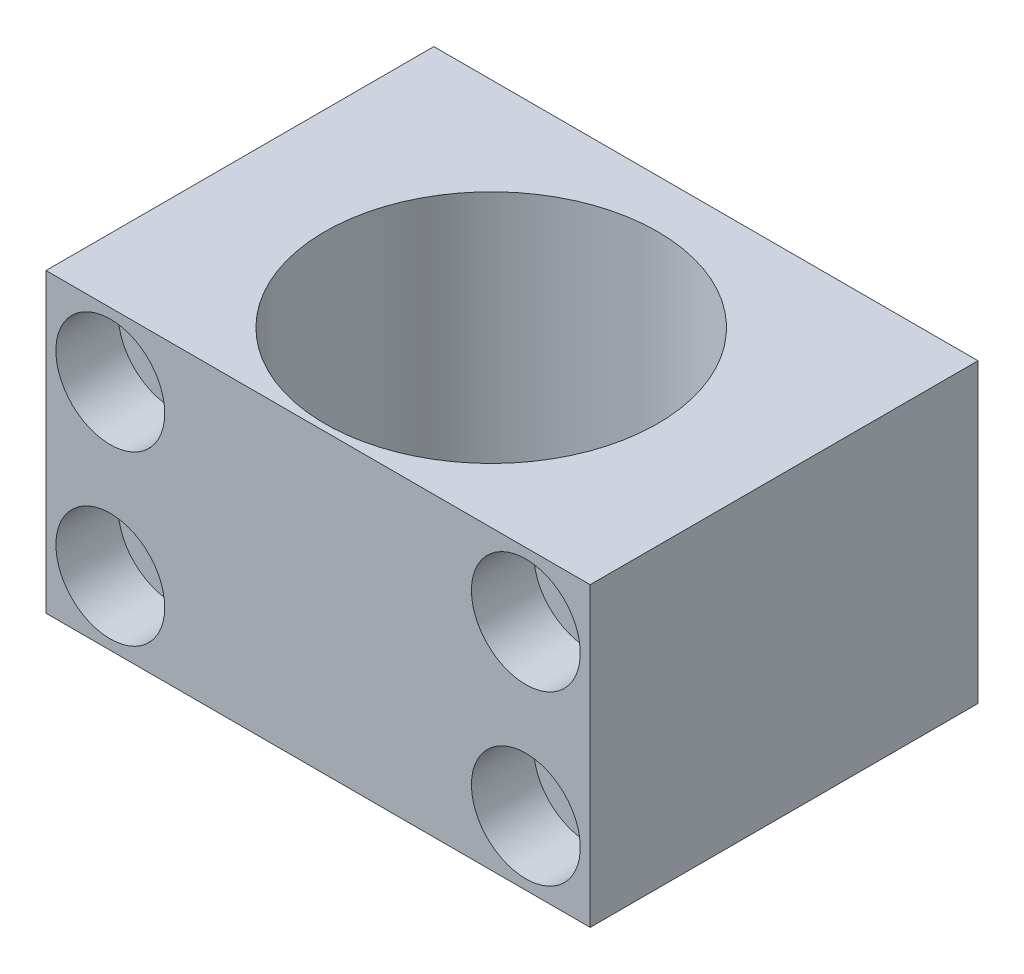
ISO-10303-21;
HEADER;
FILE_DESCRIPTION(('STEP AP214'),'2;1');
FILE_NAME('part.step','',(''),(''),'','','');
FILE_SCHEMA(('AUTOMOTIVE_DESIGN { 1 0 10303 214 1 1 1 1 }'));
ENDSEC;
DATA;
#1=APPLICATION_CONTEXT('core data for automotive mechanical design processes');
#2=APPLICATION_PROTOCOL_DEFINITION('international standard','automotive_design',2000,#1);
#3=PRODUCT_CONTEXT('',#1,'mechanical');
#4=PRODUCT('Part','Part','',(#3));
#5=PRODUCT_RELATED_PRODUCT_CATEGORY('part','',(#4));
#6=PRODUCT_DEFINITION_FORMATION('','',#4);
#7=PRODUCT_DEFINITION_CONTEXT('part definition',#1,'design');
#8=PRODUCT_DEFINITION('design','',#6,#7);
#9=PRODUCT_DEFINITION_SHAPE('','',#8);
#10=(LENGTH_UNIT() NAMED_UNIT(*) SI_UNIT(.MILLI.,.METRE.));
#11=(NAMED_UNIT(*) PLANE_ANGLE_UNIT() SI_UNIT($,.RADIAN.));
#12=(NAMED_UNIT(*) SI_UNIT($,.STERADIAN.) SOLID_ANGLE_UNIT());
#13=UNCERTAINTY_MEASURE_WITH_UNIT(LENGTH_MEASURE(1.E-05),#10,'distance_accuracy_value','');
#14=(GEOMETRIC_REPRESENTATION_CONTEXT(3) GLOBAL_UNCERTAINTY_ASSIGNED_CONTEXT((#13)) GLOBAL_UNIT_ASSIGNED_CONTEXT((#10,
#11,#12)) REPRESENTATION_CONTEXT('',''));
#15=CARTESIAN_POINT('',(0.,0.,0.));
#16=DIRECTION('',(0.,0.,1.));
#17=DIRECTION('',(1.,0.,0.));
#18=AXIS2_PLACEMENT_3D('',#15,#16,#17);
#19=CARTESIAN_POINT('',(-27.5,30.,-19.6));
#20=DIRECTION('',(1.,0.,0.));
#21=DIRECTION('',(0.,0.,-1.));
#22=AXIS2_PLACEMENT_3D('',#19,#20,#21);
#23=PLANE('',#22);
#24=DIRECTION('',(0.,0.,1.));
#25=VECTOR('',#24,1.);
#26=CARTESIAN_POINT('',(-27.5,0.,-19.6));
#27=LINE('',#26,#25);
#28=CARTESIAN_POINT('',(-27.5,0.,-19.6));
#29=VERTEX_POINT('',#28);
#30=CARTESIAN_POINT('',(-27.5,0.,19.6));
#31=VERTEX_POINT('',#30);
#32=EDGE_CURVE('E113',#29,#31,#27,.T.);
#33=ORIENTED_EDGE('',*,*,#32,.T.);
#34=DIRECTION('',(0.,-1.,0.));
#35=VECTOR('',#34,1.);
#36=CARTESIAN_POINT('',(-27.5,30.,19.6));
#37=LINE('',#36,#35);
#38=CARTESIAN_POINT('',(-27.5,30.,19.6));
#39=VERTEX_POINT('',#38);
#40=EDGE_CURVE('E11',#39,#31,#37,.T.);
#41=ORIENTED_EDGE('',*,*,#40,.F.);
#42=DIRECTION('',(0.,0.,1.));
#43=VECTOR('',#42,1.);
#44=CARTESIAN_POINT('',(-27.5,30.,-19.6));
#45=LINE('',#44,#43);
#46=CARTESIAN_POINT('',(-27.5,30.,-19.6));
#47=VERTEX_POINT('',#46);
#48=EDGE_CURVE('E98',#47,#39,#45,.T.);
#49=ORIENTED_EDGE('',*,*,#48,.F.);
#50=DIRECTION('',(0.,-1.,0.));
#51=VECTOR('',#50,1.);
#52=CARTESIAN_POINT('',(-27.5,30.,-19.6));
#53=LINE('',#52,#51);
#54=EDGE_CURVE('E112',#47,#29,#53,.T.);
#55=ORIENTED_EDGE('',*,*,#54,.T.);
#56=EDGE_LOOP('',(#33,#41,#49,#55));
#57=FACE_BOUND('',#56,.T.);
#58=ADVANCED_FACE('F42',(#57),#23,.F.);
#59=CARTESIAN_POINT('',(27.5,30.,19.6));
#60=DIRECTION('',(0.,0.,-1.));
#61=DIRECTION('',(-1.,0.,0.));
#62=AXIS2_PLACEMENT_3D('',#59,#60,#61);
#63=PLANE('',#62);
#64=CARTESIAN_POINT('',(21.,23.5,19.6));
#65=DIRECTION('',(0.,0.,1.));
#66=DIRECTION('',(-1.,0.,0.));
#67=AXIS2_PLACEMENT_3D('',#64,#65,#66);
#68=CIRCLE('',#67,5.5);
#69=CARTESIAN_POINT('',(15.5,23.5,19.6));
#70=VERTEX_POINT('',#69);
#71=EDGE_CURVE('E147',#70,#70,#68,.T.);
#72=ORIENTED_EDGE('',*,*,#71,.F.);
#73=EDGE_LOOP('',(#72));
#74=FACE_BOUND('',#73,.T.);
#75=CARTESIAN_POINT('',(21.,6.5,19.6));
#76=DIRECTION('',(0.,0.,1.));
#77=DIRECTION('',(-1.,0.,0.));
#78=AXIS2_PLACEMENT_3D('',#75,#76,#77);
#79=CIRCLE('',#78,5.5);
#80=CARTESIAN_POINT('',(15.5,6.5,19.6));
#81=VERTEX_POINT('',#80);
#82=EDGE_CURVE('E181',#81,#81,#79,.T.);
#83=ORIENTED_EDGE('',*,*,#82,.F.);
#84=EDGE_LOOP('',(#83));
#85=FACE_BOUND('',#84,.T.);
#86=CARTESIAN_POINT('',(-21.,6.5,19.6));
#87=DIRECTION('',(0.,0.,1.));
#88=DIRECTION('',(1.,0.,0.));
#89=AXIS2_PLACEMENT_3D('',#86,#87,#88);
#90=CIRCLE('',#89,5.5);
#91=CARTESIAN_POINT('',(-15.5,6.5,19.6));
#92=VERTEX_POINT('',#91);
#93=EDGE_CURVE('E166',#92,#92,#90,.T.);
#94=ORIENTED_EDGE('',*,*,#93,.F.);
#95=EDGE_LOOP('',(#94));
#96=FACE_BOUND('',#95,.T.);
#97=CARTESIAN_POINT('',(-21.,23.5,19.6));
#98=DIRECTION('',(0.,0.,1.));
#99=DIRECTION('',(1.,0.,0.));
#100=AXIS2_PLACEMENT_3D('',#97,#98,#99);
#101=CIRCLE('',#100,5.5);
#102=CARTESIAN_POINT('',(-15.5,23.5,19.6));
#103=VERTEX_POINT('',#102);
#104=EDGE_CURVE('E164',#103,#103,#101,.T.);
#105=ORIENTED_EDGE('',*,*,#104,.F.);
#106=EDGE_LOOP('',(#105));
#107=FACE_BOUND('',#106,.T.);
#108=DIRECTION('',(1.,0.,0.));
#109=VECTOR('',#108,1.);
#110=CARTESIAN_POINT('',(27.5,0.,19.6));
#111=LINE('',#110,#109);
#112=CARTESIAN_POINT('',(27.5,0.,19.6));
#113=VERTEX_POINT('',#112);
#114=EDGE_CURVE('E103',#31,#113,#111,.T.);
#115=ORIENTED_EDGE('',*,*,#114,.T.);
#116=DIRECTION('',(0.,-1.,0.));
#117=VECTOR('',#116,1.);
#118=CARTESIAN_POINT('',(27.5,30.,19.6));
#119=LINE('',#118,#117);
#120=CARTESIAN_POINT('',(27.5,30.,19.6));
#121=VERTEX_POINT('',#120);
#122=EDGE_CURVE('E53',#121,#113,#119,.T.);
#123=ORIENTED_EDGE('',*,*,#122,.F.);
#124=DIRECTION('',(1.,0.,0.));
#125=VECTOR('',#124,1.);
#126=CARTESIAN_POINT('',(27.5,30.,19.6));
#127=LINE('',#126,#125);
#128=EDGE_CURVE('E91',#39,#121,#127,.T.);
#129=ORIENTED_EDGE('',*,*,#128,.F.);
#130=ORIENTED_EDGE('',*,*,#40,.T.);
#131=EDGE_LOOP('',(#115,#123,#129,#130));
#132=FACE_BOUND('',#131,.T.);
#133=ADVANCED_FACE('F105',(#74,#85,#96,#107,#132),#63,.F.);
#134=CARTESIAN_POINT('',(27.5,30.,-19.6));
#135=DIRECTION('',(-1.,0.,0.));
#136=DIRECTION('',(0.,0.,1.));
#137=AXIS2_PLACEMENT_3D('',#134,#135,#136);
#138=PLANE('',#137);
#139=DIRECTION('',(0.,0.,-1.));
#140=VECTOR('',#139,1.);
#141=CARTESIAN_POINT('',(27.5,0.,-19.6));
#142=LINE('',#141,#140);
#143=CARTESIAN_POINT('',(27.5,0.,-19.6));
#144=VERTEX_POINT('',#143);
#145=EDGE_CURVE('E77',#113,#144,#142,.T.);
#146=ORIENTED_EDGE('',*,*,#145,.T.);
#147=DIRECTION('',(0.,-1.,0.));
#148=VECTOR('',#147,1.);
#149=CARTESIAN_POINT('',(27.5,30.,-19.6));
#150=LINE('',#149,#148);
#151=CARTESIAN_POINT('',(27.5,30.,-19.6));
#152=VERTEX_POINT('',#151);
#153=EDGE_CURVE('E104',#152,#144,#150,.T.);
#154=ORIENTED_EDGE('',*,*,#153,.F.);
#155=DIRECTION('',(0.,0.,-1.));
#156=VECTOR('',#155,1.);
#157=CARTESIAN_POINT('',(27.5,30.,-19.6));
#158=LINE('',#157,#156);
#159=EDGE_CURVE('E96',#121,#152,#158,.T.);
#160=ORIENTED_EDGE('',*,*,#159,.F.);
#161=ORIENTED_EDGE('',*,*,#122,.T.);
#162=EDGE_LOOP('',(#146,#154,#160,#161));
#163=FACE_BOUND('',#162,.T.);
#164=ADVANCED_FACE('F110',(#163),#138,.F.);
#165=CARTESIAN_POINT('',(27.5,30.,-19.6));
#166=DIRECTION('',(0.,0.,1.));
#167=DIRECTION('',(1.,0.,0.));
#168=AXIS2_PLACEMENT_3D('',#165,#166,#167);
#169=PLANE('',#168);
#170=CARTESIAN_POINT('',(21.,6.5,-19.6));
#171=DIRECTION('',(0.,0.,1.));
#172=DIRECTION('',(-1.,0.,0.));
#173=AXIS2_PLACEMENT_3D('',#170,#171,#172);
#174=CIRCLE('',#173,3.25);
#175=CARTESIAN_POINT('',(17.75,6.5,-19.6));
#176=VERTEX_POINT('',#175);
#177=EDGE_CURVE('E198',#176,#176,#174,.T.);
#178=ORIENTED_EDGE('',*,*,#177,.T.);
#179=EDGE_LOOP('',(#178));
#180=FACE_BOUND('',#179,.T.);
#181=CARTESIAN_POINT('',(21.,23.5,-19.6));
#182=DIRECTION('',(0.,0.,1.));
#183=DIRECTION('',(-1.,0.,0.));
#184=AXIS2_PLACEMENT_3D('',#181,#182,#183);
#185=CIRCLE('',#184,3.25);
#186=CARTESIAN_POINT('',(17.75,23.5,-19.6));
#187=VERTEX_POINT('',#186);
#188=EDGE_CURVE('E199',#187,#187,#185,.T.);
#189=ORIENTED_EDGE('',*,*,#188,.T.);
#190=EDGE_LOOP('',(#189));
#191=FACE_BOUND('',#190,.T.);
#192=CARTESIAN_POINT('',(-21.,23.5,-19.6));
#193=DIRECTION('',(0.,0.,1.));
#194=DIRECTION('',(1.,0.,0.));
#195=AXIS2_PLACEMENT_3D('',#192,#193,#194);
#196=CIRCLE('',#195,3.25);
#197=CARTESIAN_POINT('',(-17.75,23.5,-19.6));
#198=VERTEX_POINT('',#197);
#199=EDGE_CURVE('E194',#198,#198,#196,.T.);
#200=ORIENTED_EDGE('',*,*,#199,.T.);
#201=EDGE_LOOP('',(#200));
#202=FACE_BOUND('',#201,.T.);
#203=CARTESIAN_POINT('',(-21.,6.5,-19.6));
#204=DIRECTION('',(0.,0.,1.));
#205=DIRECTION('',(1.,0.,0.));
#206=AXIS2_PLACEMENT_3D('',#203,#204,#205);
#207=CIRCLE('',#206,3.25);
#208=CARTESIAN_POINT('',(-17.75,6.5,-19.6));
#209=VERTEX_POINT('',#208);
#210=EDGE_CURVE('E132',#209,#209,#207,.T.);
#211=ORIENTED_EDGE('',*,*,#210,.T.);
#212=EDGE_LOOP('',(#211));
#213=FACE_BOUND('',#212,.T.);
#214=DIRECTION('',(-1.,0.,0.));
#215=VECTOR('',#214,1.);
#216=CARTESIAN_POINT('',(27.5,0.,-19.6));
#217=LINE('',#216,#215);
#218=EDGE_CURVE('E88',#144,#29,#217,.T.);
#219=ORIENTED_EDGE('',*,*,#218,.T.);
#220=ORIENTED_EDGE('',*,*,#54,.F.);
#221=DIRECTION('',(-1.,0.,0.));
#222=VECTOR('',#221,1.);
#223=CARTESIAN_POINT('',(27.5,30.,-19.6));
#224=LINE('',#223,#222);
#225=EDGE_CURVE('E65',#152,#47,#224,.T.);
#226=ORIENTED_EDGE('',*,*,#225,.F.);
#227=ORIENTED_EDGE('',*,*,#153,.T.);
#228=EDGE_LOOP('',(#219,#220,#226,#227));
#229=FACE_BOUND('',#228,.T.);
#230=ADVANCED_FACE('F208',(#180,#191,#202,#213,#229),#169,.F.);
#231=CARTESIAN_POINT('',(0.,30.,0.));
#232=DIRECTION('',(0.,-1.,0.));
#233=DIRECTION('',(0.,0.,-1.));
#234=AXIS2_PLACEMENT_3D('',#231,#232,#233);
#235=PLANE('',#234);
#236=CARTESIAN_POINT('',(0.,30.,2.10000000000001));
#237=DIRECTION('',(0.,-1.,0.));
#238=DIRECTION('',(0.,0.,-1.));
#239=AXIS2_PLACEMENT_3D('',#236,#237,#238);
#240=CIRCLE('',#239,16.8183085952131);
#241=CARTESIAN_POINT('',(0.,30.,-14.7183085952131));
#242=VERTEX_POINT('',#241);
#243=EDGE_CURVE('E118',#242,#242,#240,.T.);
#244=ORIENTED_EDGE('',*,*,#243,.T.);
#245=EDGE_LOOP('',(#244));
#246=FACE_BOUND('',#245,.T.);
#247=ORIENTED_EDGE('',*,*,#48,.T.);
#248=ORIENTED_EDGE('',*,*,#128,.T.);
#249=ORIENTED_EDGE('',*,*,#159,.T.);
#250=ORIENTED_EDGE('',*,*,#225,.T.);
#251=EDGE_LOOP('',(#247,#248,#249,#250));
#252=FACE_BOUND('',#251,.T.);
#253=ADVANCED_FACE('F94',(#246,#252),#235,.F.);
#254=CARTESIAN_POINT('',(0.,0.,0.));
#255=DIRECTION('',(0.,-1.,0.));
#256=DIRECTION('',(0.,0.,-1.));
#257=AXIS2_PLACEMENT_3D('',#254,#255,#256);
#258=PLANE('',#257);
#259=CARTESIAN_POINT('',(0.,0.,2.10000000000001));
#260=DIRECTION('',(0.,-1.,0.));
#261=DIRECTION('',(0.,0.,-1.));
#262=AXIS2_PLACEMENT_3D('',#259,#260,#261);
#263=CIRCLE('',#262,16.8183085952131);
#264=CARTESIAN_POINT('',(0.,0.,-14.7183085952131));
#265=VERTEX_POINT('',#264);
#266=EDGE_CURVE('E163',#265,#265,#263,.T.);
#267=ORIENTED_EDGE('',*,*,#266,.F.);
#268=EDGE_LOOP('',(#267));
#269=FACE_BOUND('',#268,.T.);
#270=ORIENTED_EDGE('',*,*,#32,.F.);
#271=ORIENTED_EDGE('',*,*,#218,.F.);
#272=ORIENTED_EDGE('',*,*,#145,.F.);
#273=ORIENTED_EDGE('',*,*,#114,.F.);
#274=EDGE_LOOP('',(#270,#271,#272,#273));
#275=FACE_BOUND('',#274,.T.);
#276=ADVANCED_FACE('F227',(#269,#275),#258,.T.);
#277=CARTESIAN_POINT('',(0.,30.,2.10000000000001));
#278=DIRECTION('',(0.,-1.,0.));
#279=DIRECTION('',(0.,0.,-1.));
#280=AXIS2_PLACEMENT_3D('',#277,#278,#279);
#281=CYLINDRICAL_SURFACE('',#280,16.8183085952131);
#282=ORIENTED_EDGE('',*,*,#243,.F.);
#283=EDGE_LOOP('',(#282));
#284=FACE_BOUND('',#283,.T.);
#285=ORIENTED_EDGE('',*,*,#266,.T.);
#286=EDGE_LOOP('',(#285));
#287=FACE_BOUND('',#286,.T.);
#288=ADVANCED_FACE('F235',(#284,#287),#281,.F.);
#289=CARTESIAN_POINT('',(-21.,23.5,13.3));
#290=DIRECTION('',(0.,0.,1.));
#291=DIRECTION('',(1.,0.,0.));
#292=AXIS2_PLACEMENT_3D('',#289,#290,#291);
#293=CYLINDRICAL_SURFACE('',#292,5.5);
#294=CARTESIAN_POINT('',(-21.,23.5,13.3));
#295=DIRECTION('',(0.,0.,1.));
#296=DIRECTION('',(1.,0.,0.));
#297=AXIS2_PLACEMENT_3D('',#294,#295,#296);
#298=CIRCLE('',#297,5.5);
#299=CARTESIAN_POINT('',(-15.5,23.5,13.3));
#300=VERTEX_POINT('',#299);
#301=EDGE_CURVE('E159',#300,#300,#298,.T.);
#302=ORIENTED_EDGE('',*,*,#301,.F.);
#303=EDGE_LOOP('',(#302));
#304=FACE_BOUND('',#303,.T.);
#305=ORIENTED_EDGE('',*,*,#104,.T.);
#306=EDGE_LOOP('',(#305));
#307=FACE_BOUND('',#306,.T.);
#308=ADVANCED_FACE('F239',(#304,#307),#293,.F.);
#309=CARTESIAN_POINT('',(-21.,23.5,13.3));
#310=DIRECTION('',(0.,0.,1.));
#311=DIRECTION('',(1.,0.,0.));
#312=AXIS2_PLACEMENT_3D('',#309,#310,#311);
#313=PLANE('',#312);
#314=CARTESIAN_POINT('',(-21.,23.5,13.3));
#315=DIRECTION('',(0.,0.,1.));
#316=DIRECTION('',(1.,0.,0.));
#317=AXIS2_PLACEMENT_3D('',#314,#315,#316);
#318=CIRCLE('',#317,3.25);
#319=CARTESIAN_POINT('',(-17.75,23.5,13.3));
#320=VERTEX_POINT('',#319);
#321=EDGE_CURVE('E50',#320,#320,#318,.T.);
#322=ORIENTED_EDGE('',*,*,#321,.F.);
#323=EDGE_LOOP('',(#322));
#324=FACE_BOUND('',#323,.T.);
#325=ORIENTED_EDGE('',*,*,#301,.T.);
#326=EDGE_LOOP('',(#325));
#327=FACE_BOUND('',#326,.T.);
#328=ADVANCED_FACE('F284',(#324,#327),#313,.T.);
#329=CARTESIAN_POINT('',(-21.,6.5,13.3));
#330=DIRECTION('',(0.,0.,1.));
#331=DIRECTION('',(1.,0.,0.));
#332=AXIS2_PLACEMENT_3D('',#329,#330,#331);
#333=CYLINDRICAL_SURFACE('',#332,5.5);
#334=CARTESIAN_POINT('',(-21.,6.5,13.3));
#335=DIRECTION('',(0.,0.,1.));
#336=DIRECTION('',(1.,0.,0.));
#337=AXIS2_PLACEMENT_3D('',#334,#335,#336);
#338=CIRCLE('',#337,5.5);
#339=CARTESIAN_POINT('',(-15.5,6.5,13.3));
#340=VERTEX_POINT('',#339);
#341=EDGE_CURVE('E177',#340,#340,#338,.T.);
#342=ORIENTED_EDGE('',*,*,#341,.F.);
#343=EDGE_LOOP('',(#342));
#344=FACE_BOUND('',#343,.T.);
#345=ORIENTED_EDGE('',*,*,#93,.T.);
#346=EDGE_LOOP('',(#345));
#347=FACE_BOUND('',#346,.T.);
#348=ADVANCED_FACE('F295',(#344,#347),#333,.F.);
#349=CARTESIAN_POINT('',(-21.,6.5,13.3));
#350=DIRECTION('',(0.,0.,1.));
#351=DIRECTION('',(1.,0.,0.));
#352=AXIS2_PLACEMENT_3D('',#349,#350,#351);
#353=PLANE('',#352);
#354=CARTESIAN_POINT('',(-21.,6.5,13.3));
#355=DIRECTION('',(0.,0.,1.));
#356=DIRECTION('',(1.,0.,0.));
#357=AXIS2_PLACEMENT_3D('',#354,#355,#356);
#358=CIRCLE('',#357,3.25);
#359=CARTESIAN_POINT('',(-17.75,6.5,13.3));
#360=VERTEX_POINT('',#359);
#361=EDGE_CURVE('E138',#360,#360,#358,.T.);
#362=ORIENTED_EDGE('',*,*,#361,.F.);
#363=EDGE_LOOP('',(#362));
#364=FACE_BOUND('',#363,.T.);
#365=ORIENTED_EDGE('',*,*,#341,.T.);
#366=EDGE_LOOP('',(#365));
#367=FACE_BOUND('',#366,.T.);
#368=ADVANCED_FACE('F305',(#364,#367),#353,.T.);
#369=CARTESIAN_POINT('',(21.,6.5,13.3));
#370=DIRECTION('',(0.,0.,1.));
#371=DIRECTION('',(1.,0.,0.));
#372=AXIS2_PLACEMENT_3D('',#369,#370,#371);
#373=CYLINDRICAL_SURFACE('',#372,5.5);
#374=CARTESIAN_POINT('',(21.,6.5,13.3));
#375=DIRECTION('',(0.,0.,1.));
#376=DIRECTION('',(-1.,0.,0.));
#377=AXIS2_PLACEMENT_3D('',#374,#375,#376);
#378=CIRCLE('',#377,5.5);
#379=CARTESIAN_POINT('',(15.5,6.5,13.3));
#380=VERTEX_POINT('',#379);
#381=EDGE_CURVE('E156',#380,#380,#378,.T.);
#382=ORIENTED_EDGE('',*,*,#381,.F.);
#383=EDGE_LOOP('',(#382));
#384=FACE_BOUND('',#383,.T.);
#385=ORIENTED_EDGE('',*,*,#82,.T.);
#386=EDGE_LOOP('',(#385));
#387=FACE_BOUND('',#386,.T.);
#388=ADVANCED_FACE('F315',(#384,#387),#373,.F.);
#389=CARTESIAN_POINT('',(21.,6.5,13.3));
#390=DIRECTION('',(0.,0.,-1.));
#391=DIRECTION('',(-1.,0.,0.));
#392=AXIS2_PLACEMENT_3D('',#389,#390,#391);
#393=PLANE('',#392);
#394=CARTESIAN_POINT('',(21.,6.5,13.3));
#395=DIRECTION('',(0.,0.,-1.));
#396=DIRECTION('',(-1.,0.,0.));
#397=AXIS2_PLACEMENT_3D('',#394,#395,#396);
#398=CIRCLE('',#397,3.25);
#399=CARTESIAN_POINT('',(17.75,6.5,13.3));
#400=VERTEX_POINT('',#399);
#401=EDGE_CURVE('E133',#400,#400,#398,.T.);
#402=ORIENTED_EDGE('',*,*,#401,.T.);
#403=EDGE_LOOP('',(#402));
#404=FACE_BOUND('',#403,.T.);
#405=ORIENTED_EDGE('',*,*,#381,.T.);
#406=EDGE_LOOP('',(#405));
#407=FACE_BOUND('',#406,.T.);
#408=ADVANCED_FACE('F325',(#404,#407),#393,.F.);
#409=CARTESIAN_POINT('',(21.,23.5,13.3));
#410=DIRECTION('',(0.,0.,1.));
#411=DIRECTION('',(1.,0.,0.));
#412=AXIS2_PLACEMENT_3D('',#409,#410,#411);
#413=CYLINDRICAL_SURFACE('',#412,5.5);
#414=CARTESIAN_POINT('',(21.,23.5,13.3));
#415=DIRECTION('',(0.,0.,1.));
#416=DIRECTION('',(-1.,0.,0.));
#417=AXIS2_PLACEMENT_3D('',#414,#415,#416);
#418=CIRCLE('',#417,5.5);
#419=CARTESIAN_POINT('',(15.5,23.5,13.3));
#420=VERTEX_POINT('',#419);
#421=EDGE_CURVE('E144',#420,#420,#418,.T.);
#422=ORIENTED_EDGE('',*,*,#421,.F.);
#423=EDGE_LOOP('',(#422));
#424=FACE_BOUND('',#423,.T.);
#425=ORIENTED_EDGE('',*,*,#71,.T.);
#426=EDGE_LOOP('',(#425));
#427=FACE_BOUND('',#426,.T.);
#428=ADVANCED_FACE('F335',(#424,#427),#413,.F.);
#429=CARTESIAN_POINT('',(21.,23.5,13.3));
#430=DIRECTION('',(0.,0.,-1.));
#431=DIRECTION('',(-1.,0.,0.));
#432=AXIS2_PLACEMENT_3D('',#429,#430,#431);
#433=PLANE('',#432);
#434=CARTESIAN_POINT('',(21.,23.5,13.3));
#435=DIRECTION('',(0.,0.,-1.));
#436=DIRECTION('',(-1.,0.,0.));
#437=AXIS2_PLACEMENT_3D('',#434,#435,#436);
#438=CIRCLE('',#437,3.25);
#439=CARTESIAN_POINT('',(17.75,23.5,13.3));
#440=VERTEX_POINT('',#439);
#441=EDGE_CURVE('E128',#440,#440,#438,.T.);
#442=ORIENTED_EDGE('',*,*,#441,.T.);
#443=EDGE_LOOP('',(#442));
#444=FACE_BOUND('',#443,.T.);
#445=ORIENTED_EDGE('',*,*,#421,.T.);
#446=EDGE_LOOP('',(#445));
#447=FACE_BOUND('',#446,.T.);
#448=ADVANCED_FACE('F345',(#444,#447),#433,.F.);
#449=CARTESIAN_POINT('',(21.,23.5,-19.6));
#450=DIRECTION('',(0.,0.,1.));
#451=DIRECTION('',(1.,0.,0.));
#452=AXIS2_PLACEMENT_3D('',#449,#450,#451);
#453=CYLINDRICAL_SURFACE('',#452,3.25);
#454=ORIENTED_EDGE('',*,*,#188,.F.);
#455=EDGE_LOOP('',(#454));
#456=FACE_BOUND('',#455,.T.);
#457=ORIENTED_EDGE('',*,*,#441,.F.);
#458=EDGE_LOOP('',(#457));
#459=FACE_BOUND('',#458,.T.);
#460=ADVANCED_FACE('F354',(#456,#459),#453,.F.);
#461=CARTESIAN_POINT('',(21.,6.5,-19.6));
#462=DIRECTION('',(0.,0.,1.));
#463=DIRECTION('',(1.,0.,0.));
#464=AXIS2_PLACEMENT_3D('',#461,#462,#463);
#465=CYLINDRICAL_SURFACE('',#464,3.25);
#466=ORIENTED_EDGE('',*,*,#177,.F.);
#467=EDGE_LOOP('',(#466));
#468=FACE_BOUND('',#467,.T.);
#469=ORIENTED_EDGE('',*,*,#401,.F.);
#470=EDGE_LOOP('',(#469));
#471=FACE_BOUND('',#470,.T.);
#472=ADVANCED_FACE('F217',(#468,#471),#465,.F.);
#473=CARTESIAN_POINT('',(-21.,6.5,-19.6));
#474=DIRECTION('',(0.,0.,1.));
#475=DIRECTION('',(1.,0.,0.));
#476=AXIS2_PLACEMENT_3D('',#473,#474,#475);
#477=CYLINDRICAL_SURFACE('',#476,3.25);
#478=ORIENTED_EDGE('',*,*,#361,.T.);
#479=EDGE_LOOP('',(#478));
#480=FACE_BOUND('',#479,.T.);
#481=ORIENTED_EDGE('',*,*,#210,.F.);
#482=EDGE_LOOP('',(#481));
#483=FACE_BOUND('',#482,.T.);
#484=ADVANCED_FACE('F213',(#480,#483),#477,.F.);
#485=CARTESIAN_POINT('',(-21.,23.5,-19.6));
#486=DIRECTION('',(0.,0.,1.));
#487=DIRECTION('',(1.,0.,0.));
#488=AXIS2_PLACEMENT_3D('',#485,#486,#487);
#489=CYLINDRICAL_SURFACE('',#488,3.25);
#490=ORIENTED_EDGE('',*,*,#321,.T.);
#491=EDGE_LOOP('',(#490));
#492=FACE_BOUND('',#491,.T.);
#493=ORIENTED_EDGE('',*,*,#199,.F.);
#494=EDGE_LOOP('',(#493));
#495=FACE_BOUND('',#494,.T.);
#496=ADVANCED_FACE('F211',(#492,#495),#489,.F.);
#497=CLOSED_SHELL('',(#58,#133,#164,#230,#253,#276,#288,#308,#328,#348,#368,#388,#408,#428,#448,
#460,#472,#484,#496));
#498=MANIFOLD_SOLID_BREP('B2',#497);
#499=ADVANCED_BREP_SHAPE_REPRESENTATION('',(#18,#498),#14);
#500=SHAPE_DEFINITION_REPRESENTATION(#9,#499);
ENDSEC;
END-ISO-10303-21;
